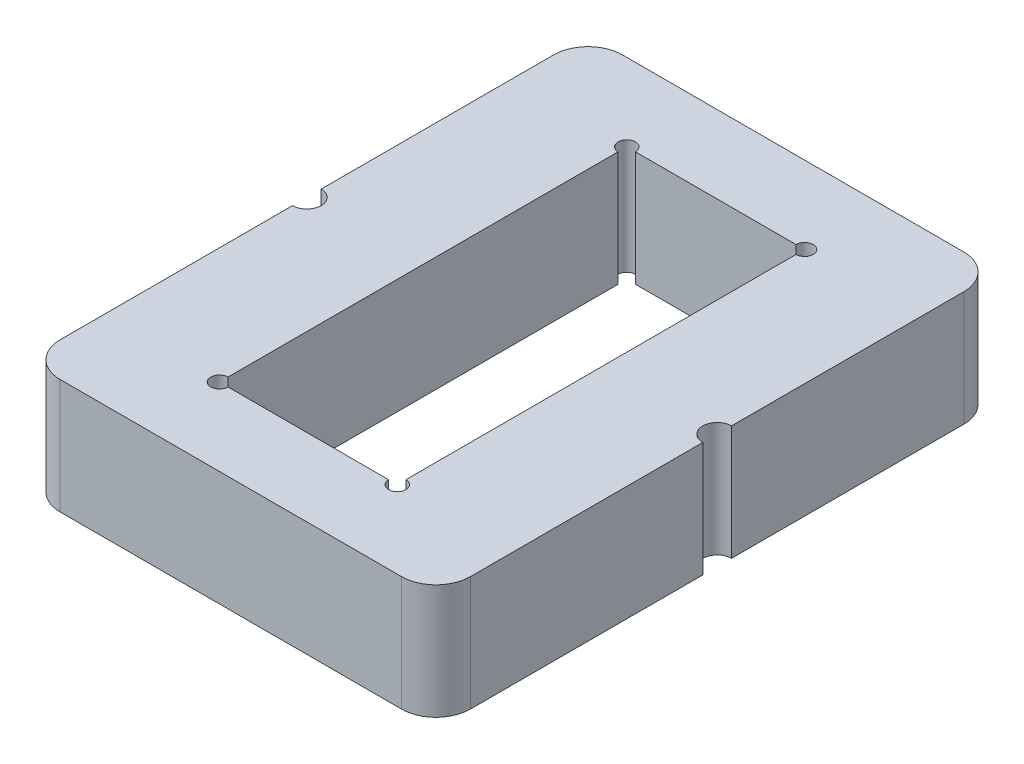
ISO-10303-21;
HEADER;
FILE_DESCRIPTION(('STEP AP214'),'2;1');
FILE_NAME('part.step','',(''),(''),'','','');
FILE_SCHEMA(('AUTOMOTIVE_DESIGN { 1 0 10303 214 1 1 1 1 }'));
ENDSEC;
DATA;
#1=APPLICATION_CONTEXT('core data for automotive mechanical design processes');
#2=APPLICATION_PROTOCOL_DEFINITION('international standard','automotive_design',2000,#1);
#3=PRODUCT_CONTEXT('',#1,'mechanical');
#4=PRODUCT('Part','Part','',(#3));
#5=PRODUCT_RELATED_PRODUCT_CATEGORY('part','',(#4));
#6=PRODUCT_DEFINITION_FORMATION('','',#4);
#7=PRODUCT_DEFINITION_CONTEXT('part definition',#1,'design');
#8=PRODUCT_DEFINITION('design','',#6,#7);
#9=PRODUCT_DEFINITION_SHAPE('','',#8);
#10=(LENGTH_UNIT() NAMED_UNIT(*) SI_UNIT(.MILLI.,.METRE.));
#11=(NAMED_UNIT(*) PLANE_ANGLE_UNIT() SI_UNIT($,.RADIAN.));
#12=(NAMED_UNIT(*) SI_UNIT($,.STERADIAN.) SOLID_ANGLE_UNIT());
#13=UNCERTAINTY_MEASURE_WITH_UNIT(LENGTH_MEASURE(1.E-05),#10,'distance_accuracy_value','');
#14=(GEOMETRIC_REPRESENTATION_CONTEXT(3) GLOBAL_UNCERTAINTY_ASSIGNED_CONTEXT((#13)) GLOBAL_UNIT_ASSIGNED_CONTEXT((#10,
#11,#12)) REPRESENTATION_CONTEXT('',''));
#15=CARTESIAN_POINT('',(0.,0.,0.));
#16=DIRECTION('',(0.,0.,1.));
#17=DIRECTION('',(1.,0.,0.));
#18=AXIS2_PLACEMENT_3D('',#15,#16,#17);
#19=CARTESIAN_POINT('',(-71.5,20.,98.));
#20=DIRECTION('',(1.,0.,0.));
#21=DIRECTION('',(0.,0.,-1.));
#22=AXIS2_PLACEMENT_3D('',#19,#20,#21);
#23=PLANE('',#22);
#24=DIRECTION('',(0.,0.,1.));
#25=VECTOR('',#24,1.);
#26=CARTESIAN_POINT('',(-71.5,-20.,98.));
#27=LINE('',#26,#25);
#28=CARTESIAN_POINT('',(-71.5,-20.,-86.));
#29=VERTEX_POINT('',#28);
#30=CARTESIAN_POINT('',(-71.5,-20.,-5.00000000000001));
#31=VERTEX_POINT('',#30);
#32=EDGE_CURVE('E204',#29,#31,#27,.T.);
#33=ORIENTED_EDGE('',*,*,#32,.T.);
#34=DIRECTION('',(0.,1.,0.));
#35=VECTOR('',#34,1.);
#36=CARTESIAN_POINT('',(-71.5,-20.,-5.00000000000001));
#37=LINE('',#36,#35);
#38=CARTESIAN_POINT('',(-71.5,20.,-5.));
#39=VERTEX_POINT('',#38);
#40=EDGE_CURVE('E11',#31,#39,#37,.T.);
#41=ORIENTED_EDGE('',*,*,#40,.T.);
#42=DIRECTION('',(0.,0.,1.));
#43=VECTOR('',#42,1.);
#44=CARTESIAN_POINT('',(-71.5,20.,98.));
#45=LINE('',#44,#43);
#46=CARTESIAN_POINT('',(-71.5,20.,-86.));
#47=VERTEX_POINT('',#46);
#48=EDGE_CURVE('E299',#47,#39,#45,.T.);
#49=ORIENTED_EDGE('',*,*,#48,.F.);
#50=DIRECTION('',(0.,-1.,0.));
#51=VECTOR('',#50,1.);
#52=CARTESIAN_POINT('',(-71.5,20.,-86.));
#53=LINE('',#52,#51);
#54=EDGE_CURVE('E251',#47,#29,#53,.T.);
#55=ORIENTED_EDGE('',*,*,#54,.T.);
#56=EDGE_LOOP('',(#33,#41,#49,#55));
#57=FACE_BOUND('',#56,.T.);
#58=ADVANCED_FACE('F34',(#57),#23,.F.);
#59=CARTESIAN_POINT('',(71.5,20.,98.));
#60=DIRECTION('',(-1.,0.,0.));
#61=DIRECTION('',(0.,0.,1.));
#62=AXIS2_PLACEMENT_3D('',#59,#60,#61);
#63=PLANE('',#62);
#64=DIRECTION('',(0.,0.,-1.));
#65=VECTOR('',#64,1.);
#66=CARTESIAN_POINT('',(71.5,-20.,98.));
#67=LINE('',#66,#65);
#68=CARTESIAN_POINT('',(71.5,-20.,86.));
#69=VERTEX_POINT('',#68);
#70=CARTESIAN_POINT('',(71.5,-20.,5.00000000000002));
#71=VERTEX_POINT('',#70);
#72=EDGE_CURVE('E186',#69,#71,#67,.T.);
#73=ORIENTED_EDGE('',*,*,#72,.T.);
#74=DIRECTION('',(0.,1.,0.));
#75=VECTOR('',#74,1.);
#76=CARTESIAN_POINT('',(71.5,-20.,5.00000000000002));
#77=LINE('',#76,#75);
#78=CARTESIAN_POINT('',(71.5,20.,5.00000000000002));
#79=VERTEX_POINT('',#78);
#80=EDGE_CURVE('E172',#71,#79,#77,.T.);
#81=ORIENTED_EDGE('',*,*,#80,.T.);
#82=DIRECTION('',(0.,0.,-1.));
#83=VECTOR('',#82,1.);
#84=CARTESIAN_POINT('',(71.5,20.,98.));
#85=LINE('',#84,#83);
#86=CARTESIAN_POINT('',(71.5,20.,86.));
#87=VERTEX_POINT('',#86);
#88=EDGE_CURVE('E183',#87,#79,#85,.T.);
#89=ORIENTED_EDGE('',*,*,#88,.F.);
#90=DIRECTION('',(0.,-1.,0.));
#91=VECTOR('',#90,1.);
#92=CARTESIAN_POINT('',(71.5,20.,86.));
#93=LINE('',#92,#91);
#94=EDGE_CURVE('E231',#87,#69,#93,.T.);
#95=ORIENTED_EDGE('',*,*,#94,.T.);
#96=EDGE_LOOP('',(#73,#81,#89,#95));
#97=FACE_BOUND('',#96,.T.);
#98=ADVANCED_FACE('F181',(#97),#63,.F.);
#99=CARTESIAN_POINT('',(0.,20.,0.));
#100=DIRECTION('',(0.,-1.,0.));
#101=DIRECTION('',(0.,0.,-1.));
#102=AXIS2_PLACEMENT_3D('',#99,#100,#101);
#103=PLANE('',#102);
#104=ORIENTED_EDGE('',*,*,#48,.T.);
#105=CARTESIAN_POINT('',(-71.5,20.,0.));
#106=DIRECTION('',(0.,1.,0.));
#107=DIRECTION('',(0.,0.,1.));
#108=AXIS2_PLACEMENT_3D('',#105,#106,#107);
#109=CIRCLE('',#108,5.);
#110=CARTESIAN_POINT('',(-71.5,20.,5.));
#111=VERTEX_POINT('',#110);
#112=EDGE_CURVE('E303',#111,#39,#109,.T.);
#113=ORIENTED_EDGE('',*,*,#112,.F.);
#114=CARTESIAN_POINT('',(-71.5,20.,86.));
#115=VERTEX_POINT('',#114);
#116=EDGE_CURVE('E216',#111,#115,#45,.T.);
#117=ORIENTED_EDGE('',*,*,#116,.T.);
#118=CARTESIAN_POINT('',(-59.5,20.,86.));
#119=DIRECTION('',(0.,-1.,0.));
#120=DIRECTION('',(0.,0.,-1.));
#121=AXIS2_PLACEMENT_3D('',#118,#119,#120);
#122=CIRCLE('',#121,12.);
#123=CARTESIAN_POINT('',(-59.5,20.,98.));
#124=VERTEX_POINT('',#123);
#125=EDGE_CURVE('E236',#115,#124,#122,.F.);
#126=ORIENTED_EDGE('',*,*,#125,.T.);
#127=DIRECTION('',(1.,0.,0.));
#128=VECTOR('',#127,1.);
#129=CARTESIAN_POINT('',(-71.5,20.,98.));
#130=LINE('',#129,#128);
#131=CARTESIAN_POINT('',(59.5,20.,98.));
#132=VERTEX_POINT('',#131);
#133=EDGE_CURVE('E200',#124,#132,#130,.T.);
#134=ORIENTED_EDGE('',*,*,#133,.T.);
#135=CARTESIAN_POINT('',(59.5,20.,86.));
#136=DIRECTION('',(0.,-1.,0.));
#137=DIRECTION('',(0.,0.,-1.));
#138=AXIS2_PLACEMENT_3D('',#135,#136,#137);
#139=CIRCLE('',#138,12.);
#140=EDGE_CURVE('E193',#132,#87,#139,.F.);
#141=ORIENTED_EDGE('',*,*,#140,.T.);
#142=ORIENTED_EDGE('',*,*,#88,.T.);
#143=CARTESIAN_POINT('',(71.5,20.,0.));
#144=DIRECTION('',(0.,1.,0.));
#145=DIRECTION('',(0.,0.,1.));
#146=AXIS2_PLACEMENT_3D('',#143,#144,#145);
#147=CIRCLE('',#146,5.);
#148=CARTESIAN_POINT('',(71.5,20.,-4.99999999999999));
#149=VERTEX_POINT('',#148);
#150=EDGE_CURVE('E169',#149,#79,#147,.T.);
#151=ORIENTED_EDGE('',*,*,#150,.F.);
#152=CARTESIAN_POINT('',(71.5,20.,-86.));
#153=VERTEX_POINT('',#152);
#154=EDGE_CURVE('E195',#149,#153,#85,.T.);
#155=ORIENTED_EDGE('',*,*,#154,.T.);
#156=CARTESIAN_POINT('',(59.5,20.,-86.));
#157=DIRECTION('',(0.,-1.,0.));
#158=DIRECTION('',(0.,0.,-1.));
#159=AXIS2_PLACEMENT_3D('',#156,#157,#158);
#160=CIRCLE('',#159,12.);
#161=CARTESIAN_POINT('',(59.5,20.,-98.));
#162=VERTEX_POINT('',#161);
#163=EDGE_CURVE('E241',#153,#162,#160,.F.);
#164=ORIENTED_EDGE('',*,*,#163,.T.);
#165=DIRECTION('',(-1.,0.,0.));
#166=VECTOR('',#165,1.);
#167=CARTESIAN_POINT('',(-71.5,20.,-98.));
#168=LINE('',#167,#166);
#169=CARTESIAN_POINT('',(-59.5,20.,-98.));
#170=VERTEX_POINT('',#169);
#171=EDGE_CURVE('E194',#162,#170,#168,.T.);
#172=ORIENTED_EDGE('',*,*,#171,.T.);
#173=CARTESIAN_POINT('',(-59.5,20.,-86.));
#174=DIRECTION('',(0.,-1.,0.));
#175=DIRECTION('',(0.,0.,-1.));
#176=AXIS2_PLACEMENT_3D('',#173,#174,#175);
#177=CIRCLE('',#176,12.);
#178=EDGE_CURVE('E238',#170,#47,#177,.F.);
#179=ORIENTED_EDGE('',*,*,#178,.T.);
#180=EDGE_LOOP('',(#104,#113,#117,#126,#134,#141,#142,#151,#155,#164,#172,#179));
#181=FACE_BOUND('',#180,.T.);
#182=DIRECTION('',(1.,0.,0.));
#183=VECTOR('',#182,1.);
#184=CARTESIAN_POINT('',(-31.,20.,71.));
#185=LINE('',#184,#183);
#186=CARTESIAN_POINT('',(-28.,20.,71.));
#187=VERTEX_POINT('',#186);
#188=CARTESIAN_POINT('',(28.,20.,71.));
#189=VERTEX_POINT('',#188);
#190=EDGE_CURVE('E273',#187,#189,#185,.T.);
#191=ORIENTED_EDGE('',*,*,#190,.F.);
#192=CARTESIAN_POINT('',(-31.,20.,71.));
#193=DIRECTION('',(0.,1.,0.));
#194=DIRECTION('',(0.,0.,1.));
#195=AXIS2_PLACEMENT_3D('',#192,#193,#194);
#196=CIRCLE('',#195,3.00000000000001);
#197=CARTESIAN_POINT('',(-31.,20.,68.));
#198=VERTEX_POINT('',#197);
#199=EDGE_CURVE('E363',#198,#187,#196,.T.);
#200=ORIENTED_EDGE('',*,*,#199,.F.);
#201=DIRECTION('',(0.,0.,1.));
#202=VECTOR('',#201,1.);
#203=CARTESIAN_POINT('',(-31.,20.,-71.));
#204=LINE('',#203,#202);
#205=CARTESIAN_POINT('',(-31.,20.,-68.));
#206=VERTEX_POINT('',#205);
#207=EDGE_CURVE('E275',#206,#198,#204,.T.);
#208=ORIENTED_EDGE('',*,*,#207,.F.);
#209=CARTESIAN_POINT('',(-31.,20.,-71.));
#210=DIRECTION('',(0.,1.,0.));
#211=DIRECTION('',(0.,0.,1.));
#212=AXIS2_PLACEMENT_3D('',#209,#210,#211);
#213=CIRCLE('',#212,3.00000000000001);
#214=CARTESIAN_POINT('',(-28.,20.,-71.));
#215=VERTEX_POINT('',#214);
#216=EDGE_CURVE('E370',#215,#206,#213,.T.);
#217=ORIENTED_EDGE('',*,*,#216,.F.);
#218=DIRECTION('',(-1.,0.,0.));
#219=VECTOR('',#218,1.);
#220=CARTESIAN_POINT('',(-31.,20.,-71.));
#221=LINE('',#220,#219);
#222=CARTESIAN_POINT('',(28.,20.,-71.));
#223=VERTEX_POINT('',#222);
#224=EDGE_CURVE('E282',#223,#215,#221,.T.);
#225=ORIENTED_EDGE('',*,*,#224,.F.);
#226=CARTESIAN_POINT('',(31.,20.,-71.));
#227=DIRECTION('',(0.,1.,0.));
#228=DIRECTION('',(0.,0.,1.));
#229=AXIS2_PLACEMENT_3D('',#226,#227,#228);
#230=CIRCLE('',#229,2.99999999999999);
#231=CARTESIAN_POINT('',(31.,20.,-68.));
#232=VERTEX_POINT('',#231);
#233=EDGE_CURVE('E371',#232,#223,#230,.T.);
#234=ORIENTED_EDGE('',*,*,#233,.F.);
#235=DIRECTION('',(0.,0.,-1.));
#236=VECTOR('',#235,1.);
#237=CARTESIAN_POINT('',(31.,20.,-71.));
#238=LINE('',#237,#236);
#239=CARTESIAN_POINT('',(31.,20.,68.));
#240=VERTEX_POINT('',#239);
#241=EDGE_CURVE('E298',#240,#232,#238,.T.);
#242=ORIENTED_EDGE('',*,*,#241,.F.);
#243=CARTESIAN_POINT('',(31.,20.,71.));
#244=DIRECTION('',(0.,1.,0.));
#245=DIRECTION('',(0.,0.,1.));
#246=AXIS2_PLACEMENT_3D('',#243,#244,#245);
#247=CIRCLE('',#246,2.99999999999999);
#248=EDGE_CURVE('E376',#189,#240,#247,.T.);
#249=ORIENTED_EDGE('',*,*,#248,.F.);
#250=EDGE_LOOP('',(#191,#200,#208,#217,#225,#234,#242,#249));
#251=FACE_BOUND('',#250,.T.);
#252=ADVANCED_FACE('F189',(#181,#251),#103,.F.);
#253=CARTESIAN_POINT('',(0.,-20.,0.));
#254=DIRECTION('',(0.,-1.,0.));
#255=DIRECTION('',(0.,0.,-1.));
#256=AXIS2_PLACEMENT_3D('',#253,#254,#255);
#257=PLANE('',#256);
#258=CARTESIAN_POINT('',(-71.5,-20.,0.));
#259=DIRECTION('',(0.,1.,0.));
#260=DIRECTION('',(0.,0.,1.));
#261=AXIS2_PLACEMENT_3D('',#258,#259,#260);
#262=CIRCLE('',#261,5.);
#263=CARTESIAN_POINT('',(-71.5,-20.,5.));
#264=VERTEX_POINT('',#263);
#265=EDGE_CURVE('E49',#264,#31,#262,.T.);
#266=ORIENTED_EDGE('',*,*,#265,.T.);
#267=ORIENTED_EDGE('',*,*,#32,.F.);
#268=CARTESIAN_POINT('',(-59.5,-20.,-86.));
#269=DIRECTION('',(0.,-1.,0.));
#270=DIRECTION('',(0.,0.,-1.));
#271=AXIS2_PLACEMENT_3D('',#268,#269,#270);
#272=CIRCLE('',#271,12.);
#273=CARTESIAN_POINT('',(-59.5,-20.,-98.));
#274=VERTEX_POINT('',#273);
#275=EDGE_CURVE('E224',#29,#274,#272,.T.);
#276=ORIENTED_EDGE('',*,*,#275,.T.);
#277=DIRECTION('',(-1.,0.,0.));
#278=VECTOR('',#277,1.);
#279=CARTESIAN_POINT('',(-71.5,-20.,-98.));
#280=LINE('',#279,#278);
#281=CARTESIAN_POINT('',(59.5,-20.,-98.));
#282=VERTEX_POINT('',#281);
#283=EDGE_CURVE('E213',#282,#274,#280,.T.);
#284=ORIENTED_EDGE('',*,*,#283,.F.);
#285=CARTESIAN_POINT('',(59.5,-20.,-86.));
#286=DIRECTION('',(0.,-1.,0.));
#287=DIRECTION('',(0.,0.,-1.));
#288=AXIS2_PLACEMENT_3D('',#285,#286,#287);
#289=CIRCLE('',#288,12.);
#290=CARTESIAN_POINT('',(71.5,-20.,-86.));
#291=VERTEX_POINT('',#290);
#292=EDGE_CURVE('E228',#282,#291,#289,.T.);
#293=ORIENTED_EDGE('',*,*,#292,.T.);
#294=CARTESIAN_POINT('',(71.5,-20.,-4.99999999999999));
#295=VERTEX_POINT('',#294);
#296=EDGE_CURVE('E211',#295,#291,#67,.T.);
#297=ORIENTED_EDGE('',*,*,#296,.F.);
#298=CARTESIAN_POINT('',(71.5,-20.,0.));
#299=DIRECTION('',(0.,1.,0.));
#300=DIRECTION('',(0.,0.,1.));
#301=AXIS2_PLACEMENT_3D('',#298,#299,#300);
#302=CIRCLE('',#301,5.);
#303=EDGE_CURVE('E57',#295,#71,#302,.T.);
#304=ORIENTED_EDGE('',*,*,#303,.T.);
#305=ORIENTED_EDGE('',*,*,#72,.F.);
#306=CARTESIAN_POINT('',(59.5,-20.,86.));
#307=DIRECTION('',(0.,-1.,0.));
#308=DIRECTION('',(0.,0.,-1.));
#309=AXIS2_PLACEMENT_3D('',#306,#307,#308);
#310=CIRCLE('',#309,12.);
#311=CARTESIAN_POINT('',(59.5,-20.,98.));
#312=VERTEX_POINT('',#311);
#313=EDGE_CURVE('E226',#69,#312,#310,.T.);
#314=ORIENTED_EDGE('',*,*,#313,.T.);
#315=DIRECTION('',(1.,0.,0.));
#316=VECTOR('',#315,1.);
#317=CARTESIAN_POINT('',(-71.5,-20.,98.));
#318=LINE('',#317,#316);
#319=CARTESIAN_POINT('',(-59.5,-20.,98.));
#320=VERTEX_POINT('',#319);
#321=EDGE_CURVE('E207',#320,#312,#318,.T.);
#322=ORIENTED_EDGE('',*,*,#321,.F.);
#323=CARTESIAN_POINT('',(-59.5,-20.,86.));
#324=DIRECTION('',(0.,-1.,0.));
#325=DIRECTION('',(0.,0.,-1.));
#326=AXIS2_PLACEMENT_3D('',#323,#324,#325);
#327=CIRCLE('',#326,12.);
#328=CARTESIAN_POINT('',(-71.5,-20.,86.));
#329=VERTEX_POINT('',#328);
#330=EDGE_CURVE('E221',#320,#329,#327,.T.);
#331=ORIENTED_EDGE('',*,*,#330,.T.);
#332=EDGE_CURVE('E208',#264,#329,#27,.T.);
#333=ORIENTED_EDGE('',*,*,#332,.F.);
#334=EDGE_LOOP('',(#266,#267,#276,#284,#293,#297,#304,#305,#314,#322,#331,#333));
#335=FACE_BOUND('',#334,.T.);
#336=CARTESIAN_POINT('',(-31.,-20.,71.));
#337=DIRECTION('',(0.,1.,0.));
#338=DIRECTION('',(0.,0.,1.));
#339=AXIS2_PLACEMENT_3D('',#336,#337,#338);
#340=CIRCLE('',#339,3.00000000000001);
#341=CARTESIAN_POINT('',(-31.,-20.,68.));
#342=VERTEX_POINT('',#341);
#343=CARTESIAN_POINT('',(-28.,-20.,71.));
#344=VERTEX_POINT('',#343);
#345=EDGE_CURVE('E378',#342,#344,#340,.T.);
#346=ORIENTED_EDGE('',*,*,#345,.T.);
#347=DIRECTION('',(1.,0.,0.));
#348=VECTOR('',#347,1.);
#349=CARTESIAN_POINT('',(-31.,-20.,71.));
#350=LINE('',#349,#348);
#351=CARTESIAN_POINT('',(28.,-20.,71.));
#352=VERTEX_POINT('',#351);
#353=EDGE_CURVE('E296',#344,#352,#350,.T.);
#354=ORIENTED_EDGE('',*,*,#353,.T.);
#355=CARTESIAN_POINT('',(31.,-20.,71.));
#356=DIRECTION('',(0.,1.,0.));
#357=DIRECTION('',(0.,0.,1.));
#358=AXIS2_PLACEMENT_3D('',#355,#356,#357);
#359=CIRCLE('',#358,2.99999999999999);
#360=CARTESIAN_POINT('',(31.,-20.,68.));
#361=VERTEX_POINT('',#360);
#362=EDGE_CURVE('E373',#352,#361,#359,.T.);
#363=ORIENTED_EDGE('',*,*,#362,.T.);
#364=DIRECTION('',(0.,0.,-1.));
#365=VECTOR('',#364,1.);
#366=CARTESIAN_POINT('',(31.,-20.,-71.));
#367=LINE('',#366,#365);
#368=CARTESIAN_POINT('',(31.,-20.,-68.));
#369=VERTEX_POINT('',#368);
#370=EDGE_CURVE('E286',#361,#369,#367,.T.);
#371=ORIENTED_EDGE('',*,*,#370,.T.);
#372=CARTESIAN_POINT('',(31.,-20.,-71.));
#373=DIRECTION('',(0.,1.,0.));
#374=DIRECTION('',(0.,0.,1.));
#375=AXIS2_PLACEMENT_3D('',#372,#373,#374);
#376=CIRCLE('',#375,2.99999999999999);
#377=CARTESIAN_POINT('',(28.,-20.,-71.));
#378=VERTEX_POINT('',#377);
#379=EDGE_CURVE('E367',#369,#378,#376,.T.);
#380=ORIENTED_EDGE('',*,*,#379,.T.);
#381=DIRECTION('',(-1.,0.,0.));
#382=VECTOR('',#381,1.);
#383=CARTESIAN_POINT('',(-31.,-20.,-71.));
#384=LINE('',#383,#382);
#385=CARTESIAN_POINT('',(-28.,-20.,-71.));
#386=VERTEX_POINT('',#385);
#387=EDGE_CURVE('E289',#378,#386,#384,.T.);
#388=ORIENTED_EDGE('',*,*,#387,.T.);
#389=CARTESIAN_POINT('',(-31.,-20.,-71.));
#390=DIRECTION('',(0.,1.,0.));
#391=DIRECTION('',(0.,0.,1.));
#392=AXIS2_PLACEMENT_3D('',#389,#390,#391);
#393=CIRCLE('',#392,3.00000000000001);
#394=CARTESIAN_POINT('',(-31.,-20.,-68.));
#395=VERTEX_POINT('',#394);
#396=EDGE_CURVE('E382',#386,#395,#393,.T.);
#397=ORIENTED_EDGE('',*,*,#396,.T.);
#398=DIRECTION('',(0.,0.,1.));
#399=VECTOR('',#398,1.);
#400=CARTESIAN_POINT('',(-31.,-20.,-71.));
#401=LINE('',#400,#399);
#402=EDGE_CURVE('E293',#395,#342,#401,.T.);
#403=ORIENTED_EDGE('',*,*,#402,.T.);
#404=EDGE_LOOP('',(#346,#354,#363,#371,#380,#388,#397,#403));
#405=FACE_BOUND('',#404,.T.);
#406=ADVANCED_FACE('F268',(#335,#405),#257,.T.);
#407=ORIENTED_EDGE('',*,*,#116,.F.);
#408=DIRECTION('',(0.,1.,0.));
#409=VECTOR('',#408,1.);
#410=CARTESIAN_POINT('',(-71.5,-20.,5.));
#411=LINE('',#410,#409);
#412=EDGE_CURVE('E42',#111,#264,#411,.F.);
#413=ORIENTED_EDGE('',*,*,#412,.T.);
#414=ORIENTED_EDGE('',*,*,#332,.T.);
#415=DIRECTION('',(0.,-1.,0.));
#416=VECTOR('',#415,1.);
#417=CARTESIAN_POINT('',(-71.5,20.,86.));
#418=LINE('',#417,#416);
#419=EDGE_CURVE('E248',#329,#115,#418,.F.);
#420=ORIENTED_EDGE('',*,*,#419,.T.);
#421=EDGE_LOOP('',(#407,#413,#414,#420));
#422=FACE_BOUND('',#421,.T.);
#423=ADVANCED_FACE('F265',(#422),#23,.F.);
#424=CARTESIAN_POINT('',(-71.5,20.,98.));
#425=DIRECTION('',(0.,0.,-1.));
#426=DIRECTION('',(-1.,0.,0.));
#427=AXIS2_PLACEMENT_3D('',#424,#425,#426);
#428=PLANE('',#427);
#429=ORIENTED_EDGE('',*,*,#321,.T.);
#430=DIRECTION('',(0.,-1.,0.));
#431=VECTOR('',#430,1.);
#432=CARTESIAN_POINT('',(59.5,20.,98.));
#433=LINE('',#432,#431);
#434=EDGE_CURVE('E246',#312,#132,#433,.F.);
#435=ORIENTED_EDGE('',*,*,#434,.T.);
#436=ORIENTED_EDGE('',*,*,#133,.F.);
#437=DIRECTION('',(0.,-1.,0.));
#438=VECTOR('',#437,1.);
#439=CARTESIAN_POINT('',(-59.5,20.,98.));
#440=LINE('',#439,#438);
#441=EDGE_CURVE('E243',#124,#320,#440,.T.);
#442=ORIENTED_EDGE('',*,*,#441,.T.);
#443=EDGE_LOOP('',(#429,#435,#436,#442));
#444=FACE_BOUND('',#443,.T.);
#445=ADVANCED_FACE('F307',(#444),#428,.F.);
#446=ORIENTED_EDGE('',*,*,#154,.F.);
#447=DIRECTION('',(0.,1.,0.));
#448=VECTOR('',#447,1.);
#449=CARTESIAN_POINT('',(71.5,-20.,-4.99999999999999));
#450=LINE('',#449,#448);
#451=EDGE_CURVE('E173',#149,#295,#450,.F.);
#452=ORIENTED_EDGE('',*,*,#451,.T.);
#453=ORIENTED_EDGE('',*,*,#296,.T.);
#454=DIRECTION('',(0.,-1.,0.));
#455=VECTOR('',#454,1.);
#456=CARTESIAN_POINT('',(71.5,20.,-86.));
#457=LINE('',#456,#455);
#458=EDGE_CURVE('E233',#291,#153,#457,.F.);
#459=ORIENTED_EDGE('',*,*,#458,.T.);
#460=EDGE_LOOP('',(#446,#452,#453,#459));
#461=FACE_BOUND('',#460,.T.);
#462=ADVANCED_FACE('F330',(#461),#63,.F.);
#463=CARTESIAN_POINT('',(-71.5,20.,-98.));
#464=DIRECTION('',(0.,0.,1.));
#465=DIRECTION('',(1.,0.,0.));
#466=AXIS2_PLACEMENT_3D('',#463,#464,#465);
#467=PLANE('',#466);
#468=ORIENTED_EDGE('',*,*,#171,.F.);
#469=DIRECTION('',(0.,-1.,0.));
#470=VECTOR('',#469,1.);
#471=CARTESIAN_POINT('',(59.5,20.,-98.));
#472=LINE('',#471,#470);
#473=EDGE_CURVE('E218',#162,#282,#472,.T.);
#474=ORIENTED_EDGE('',*,*,#473,.T.);
#475=ORIENTED_EDGE('',*,*,#283,.T.);
#476=DIRECTION('',(0.,-1.,0.));
#477=VECTOR('',#476,1.);
#478=CARTESIAN_POINT('',(-59.5,20.,-98.));
#479=LINE('',#478,#477);
#480=EDGE_CURVE('E198',#274,#170,#479,.F.);
#481=ORIENTED_EDGE('',*,*,#480,.T.);
#482=EDGE_LOOP('',(#468,#474,#475,#481));
#483=FACE_BOUND('',#482,.T.);
#484=ADVANCED_FACE('F344',(#483),#467,.F.);
#485=CARTESIAN_POINT('',(31.,20.,-71.));
#486=DIRECTION('',(-1.,0.,0.));
#487=DIRECTION('',(0.,0.,1.));
#488=AXIS2_PLACEMENT_3D('',#485,#486,#487);
#489=PLANE('',#488);
#490=DIRECTION('',(0.,1.,0.));
#491=VECTOR('',#490,1.);
#492=CARTESIAN_POINT('',(31.,-20.,68.));
#493=LINE('',#492,#491);
#494=EDGE_CURVE('E385',#240,#361,#493,.F.);
#495=ORIENTED_EDGE('',*,*,#494,.F.);
#496=ORIENTED_EDGE('',*,*,#241,.T.);
#497=DIRECTION('',(0.,1.,0.));
#498=VECTOR('',#497,1.);
#499=CARTESIAN_POINT('',(31.,-20.,-68.));
#500=LINE('',#499,#498);
#501=EDGE_CURVE('E290',#369,#232,#500,.T.);
#502=ORIENTED_EDGE('',*,*,#501,.F.);
#503=ORIENTED_EDGE('',*,*,#370,.F.);
#504=EDGE_LOOP('',(#495,#496,#502,#503));
#505=FACE_BOUND('',#504,.T.);
#506=ADVANCED_FACE('F346',(#505),#489,.T.);
#507=CARTESIAN_POINT('',(-31.,20.,-71.));
#508=DIRECTION('',(0.,0.,1.));
#509=DIRECTION('',(1.,0.,0.));
#510=AXIS2_PLACEMENT_3D('',#507,#508,#509);
#511=PLANE('',#510);
#512=DIRECTION('',(0.,1.,0.));
#513=VECTOR('',#512,1.);
#514=CARTESIAN_POINT('',(28.,-20.,-71.));
#515=LINE('',#514,#513);
#516=EDGE_CURVE('E260',#223,#378,#515,.F.);
#517=ORIENTED_EDGE('',*,*,#516,.F.);
#518=ORIENTED_EDGE('',*,*,#224,.T.);
#519=DIRECTION('',(0.,1.,0.));
#520=VECTOR('',#519,1.);
#521=CARTESIAN_POINT('',(-28.,-20.,-71.));
#522=LINE('',#521,#520);
#523=EDGE_CURVE('E390',#386,#215,#522,.T.);
#524=ORIENTED_EDGE('',*,*,#523,.F.);
#525=ORIENTED_EDGE('',*,*,#387,.F.);
#526=EDGE_LOOP('',(#517,#518,#524,#525));
#527=FACE_BOUND('',#526,.T.);
#528=ADVANCED_FACE('F399',(#527),#511,.T.);
#529=CARTESIAN_POINT('',(-31.,20.,-71.));
#530=DIRECTION('',(1.,0.,0.));
#531=DIRECTION('',(0.,0.,-1.));
#532=AXIS2_PLACEMENT_3D('',#529,#530,#531);
#533=PLANE('',#532);
#534=DIRECTION('',(0.,1.,0.));
#535=VECTOR('',#534,1.);
#536=CARTESIAN_POINT('',(-31.,-20.,68.));
#537=LINE('',#536,#535);
#538=EDGE_CURVE('E388',#342,#198,#537,.T.);
#539=ORIENTED_EDGE('',*,*,#538,.F.);
#540=ORIENTED_EDGE('',*,*,#402,.F.);
#541=DIRECTION('',(0.,1.,0.));
#542=VECTOR('',#541,1.);
#543=CARTESIAN_POINT('',(-31.,-20.,-68.));
#544=LINE('',#543,#542);
#545=EDGE_CURVE('E258',#206,#395,#544,.F.);
#546=ORIENTED_EDGE('',*,*,#545,.F.);
#547=ORIENTED_EDGE('',*,*,#207,.T.);
#548=EDGE_LOOP('',(#539,#540,#546,#547));
#549=FACE_BOUND('',#548,.T.);
#550=ADVANCED_FACE('F412',(#549),#533,.T.);
#551=CARTESIAN_POINT('',(-31.,20.,71.));
#552=DIRECTION('',(0.,0.,-1.));
#553=DIRECTION('',(-1.,0.,0.));
#554=AXIS2_PLACEMENT_3D('',#551,#552,#553);
#555=PLANE('',#554);
#556=DIRECTION('',(0.,1.,0.));
#557=VECTOR('',#556,1.);
#558=CARTESIAN_POINT('',(-28.,-20.,71.));
#559=LINE('',#558,#557);
#560=EDGE_CURVE('E256',#187,#344,#559,.F.);
#561=ORIENTED_EDGE('',*,*,#560,.F.);
#562=ORIENTED_EDGE('',*,*,#190,.T.);
#563=DIRECTION('',(0.,1.,0.));
#564=VECTOR('',#563,1.);
#565=CARTESIAN_POINT('',(28.,-20.,71.));
#566=LINE('',#565,#564);
#567=EDGE_CURVE('E254',#352,#189,#566,.T.);
#568=ORIENTED_EDGE('',*,*,#567,.F.);
#569=ORIENTED_EDGE('',*,*,#353,.F.);
#570=EDGE_LOOP('',(#561,#562,#568,#569));
#571=FACE_BOUND('',#570,.T.);
#572=ADVANCED_FACE('F320',(#571),#555,.T.);
#573=CARTESIAN_POINT('',(59.5,20.,-86.));
#574=DIRECTION('',(0.,-1.,0.));
#575=DIRECTION('',(0.,0.,-1.));
#576=AXIS2_PLACEMENT_3D('',#573,#574,#575);
#577=CYLINDRICAL_SURFACE('',#576,12.);
#578=ORIENTED_EDGE('',*,*,#163,.F.);
#579=ORIENTED_EDGE('',*,*,#458,.F.);
#580=ORIENTED_EDGE('',*,*,#292,.F.);
#581=ORIENTED_EDGE('',*,*,#473,.F.);
#582=EDGE_LOOP('',(#578,#579,#580,#581));
#583=FACE_BOUND('',#582,.T.);
#584=ADVANCED_FACE('F313',(#583),#577,.T.);
#585=CARTESIAN_POINT('',(59.5,20.,86.));
#586=DIRECTION('',(0.,-1.,0.));
#587=DIRECTION('',(0.,0.,-1.));
#588=AXIS2_PLACEMENT_3D('',#585,#586,#587);
#589=CYLINDRICAL_SURFACE('',#588,12.);
#590=ORIENTED_EDGE('',*,*,#140,.F.);
#591=ORIENTED_EDGE('',*,*,#434,.F.);
#592=ORIENTED_EDGE('',*,*,#313,.F.);
#593=ORIENTED_EDGE('',*,*,#94,.F.);
#594=EDGE_LOOP('',(#590,#591,#592,#593));
#595=FACE_BOUND('',#594,.T.);
#596=ADVANCED_FACE('F310',(#595),#589,.T.);
#597=CARTESIAN_POINT('',(-59.5,20.,-86.));
#598=DIRECTION('',(0.,-1.,0.));
#599=DIRECTION('',(0.,0.,-1.));
#600=AXIS2_PLACEMENT_3D('',#597,#598,#599);
#601=CYLINDRICAL_SURFACE('',#600,12.);
#602=ORIENTED_EDGE('',*,*,#178,.F.);
#603=ORIENTED_EDGE('',*,*,#480,.F.);
#604=ORIENTED_EDGE('',*,*,#275,.F.);
#605=ORIENTED_EDGE('',*,*,#54,.F.);
#606=EDGE_LOOP('',(#602,#603,#604,#605));
#607=FACE_BOUND('',#606,.T.);
#608=ADVANCED_FACE('F312',(#607),#601,.T.);
#609=CARTESIAN_POINT('',(-59.5,20.,86.));
#610=DIRECTION('',(0.,-1.,0.));
#611=DIRECTION('',(0.,0.,-1.));
#612=AXIS2_PLACEMENT_3D('',#609,#610,#611);
#613=CYLINDRICAL_SURFACE('',#612,12.);
#614=ORIENTED_EDGE('',*,*,#125,.F.);
#615=ORIENTED_EDGE('',*,*,#419,.F.);
#616=ORIENTED_EDGE('',*,*,#330,.F.);
#617=ORIENTED_EDGE('',*,*,#441,.F.);
#618=EDGE_LOOP('',(#614,#615,#616,#617));
#619=FACE_BOUND('',#618,.T.);
#620=ADVANCED_FACE('F36',(#619),#613,.T.);
#621=CARTESIAN_POINT('',(31.,-20.,71.));
#622=DIRECTION('',(0.,1.,0.));
#623=DIRECTION('',(0.,0.,1.));
#624=AXIS2_PLACEMENT_3D('',#621,#622,#623);
#625=CYLINDRICAL_SURFACE('',#624,2.99999999999999);
#626=ORIENTED_EDGE('',*,*,#494,.T.);
#627=ORIENTED_EDGE('',*,*,#362,.F.);
#628=ORIENTED_EDGE('',*,*,#567,.T.);
#629=ORIENTED_EDGE('',*,*,#248,.T.);
#630=EDGE_LOOP('',(#626,#627,#628,#629));
#631=FACE_BOUND('',#630,.T.);
#632=ADVANCED_FACE('F422',(#631),#625,.F.);
#633=CARTESIAN_POINT('',(-31.,-20.,71.));
#634=DIRECTION('',(0.,1.,0.));
#635=DIRECTION('',(0.,0.,1.));
#636=AXIS2_PLACEMENT_3D('',#633,#634,#635);
#637=CYLINDRICAL_SURFACE('',#636,3.00000000000001);
#638=ORIENTED_EDGE('',*,*,#538,.T.);
#639=ORIENTED_EDGE('',*,*,#199,.T.);
#640=ORIENTED_EDGE('',*,*,#560,.T.);
#641=ORIENTED_EDGE('',*,*,#345,.F.);
#642=EDGE_LOOP('',(#638,#639,#640,#641));
#643=FACE_BOUND('',#642,.T.);
#644=ADVANCED_FACE('F424',(#643),#637,.F.);
#645=CARTESIAN_POINT('',(-31.,-20.,-71.));
#646=DIRECTION('',(0.,1.,0.));
#647=DIRECTION('',(0.,0.,1.));
#648=AXIS2_PLACEMENT_3D('',#645,#646,#647);
#649=CYLINDRICAL_SURFACE('',#648,3.00000000000001);
#650=ORIENTED_EDGE('',*,*,#523,.T.);
#651=ORIENTED_EDGE('',*,*,#216,.T.);
#652=ORIENTED_EDGE('',*,*,#545,.T.);
#653=ORIENTED_EDGE('',*,*,#396,.F.);
#654=EDGE_LOOP('',(#650,#651,#652,#653));
#655=FACE_BOUND('',#654,.T.);
#656=ADVANCED_FACE('F408',(#655),#649,.F.);
#657=CARTESIAN_POINT('',(31.,-20.,-71.));
#658=DIRECTION('',(0.,1.,0.));
#659=DIRECTION('',(0.,0.,1.));
#660=AXIS2_PLACEMENT_3D('',#657,#658,#659);
#661=CYLINDRICAL_SURFACE('',#660,2.99999999999999);
#662=ORIENTED_EDGE('',*,*,#501,.T.);
#663=ORIENTED_EDGE('',*,*,#233,.T.);
#664=ORIENTED_EDGE('',*,*,#516,.T.);
#665=ORIENTED_EDGE('',*,*,#379,.F.);
#666=EDGE_LOOP('',(#662,#663,#664,#665));
#667=FACE_BOUND('',#666,.T.);
#668=ADVANCED_FACE('F417',(#667),#661,.F.);
#669=CARTESIAN_POINT('',(71.5,-20.,0.));
#670=DIRECTION('',(0.,1.,0.));
#671=DIRECTION('',(0.,0.,1.));
#672=AXIS2_PLACEMENT_3D('',#669,#670,#671);
#673=CYLINDRICAL_SURFACE('',#672,5.);
#674=ORIENTED_EDGE('',*,*,#303,.F.);
#675=ORIENTED_EDGE('',*,*,#451,.F.);
#676=ORIENTED_EDGE('',*,*,#150,.T.);
#677=ORIENTED_EDGE('',*,*,#80,.F.);
#678=EDGE_LOOP('',(#674,#675,#676,#677));
#679=FACE_BOUND('',#678,.T.);
#680=ADVANCED_FACE('F171',(#679),#673,.F.);
#681=CARTESIAN_POINT('',(-71.5,-20.,0.));
#682=DIRECTION('',(0.,1.,0.));
#683=DIRECTION('',(0.,0.,1.));
#684=AXIS2_PLACEMENT_3D('',#681,#682,#683);
#685=CYLINDRICAL_SURFACE('',#684,5.);
#686=ORIENTED_EDGE('',*,*,#265,.F.);
#687=ORIENTED_EDGE('',*,*,#412,.F.);
#688=ORIENTED_EDGE('',*,*,#112,.T.);
#689=ORIENTED_EDGE('',*,*,#40,.F.);
#690=EDGE_LOOP('',(#686,#687,#688,#689));
#691=FACE_BOUND('',#690,.T.);
#692=ADVANCED_FACE('F361',(#691),#685,.F.);
#693=CLOSED_SHELL('',(#58,#98,#252,#406,#423,#445,#462,#484,#506,#528,#550,#572,#584,#596,#608,
#620,#632,#644,#656,#668,#680,#692));
#694=MANIFOLD_SOLID_BREP('B2',#693);
#695=ADVANCED_BREP_SHAPE_REPRESENTATION('',(#18,#694),#14);
#696=SHAPE_DEFINITION_REPRESENTATION(#9,#695);
ENDSEC;
END-ISO-10303-21;
